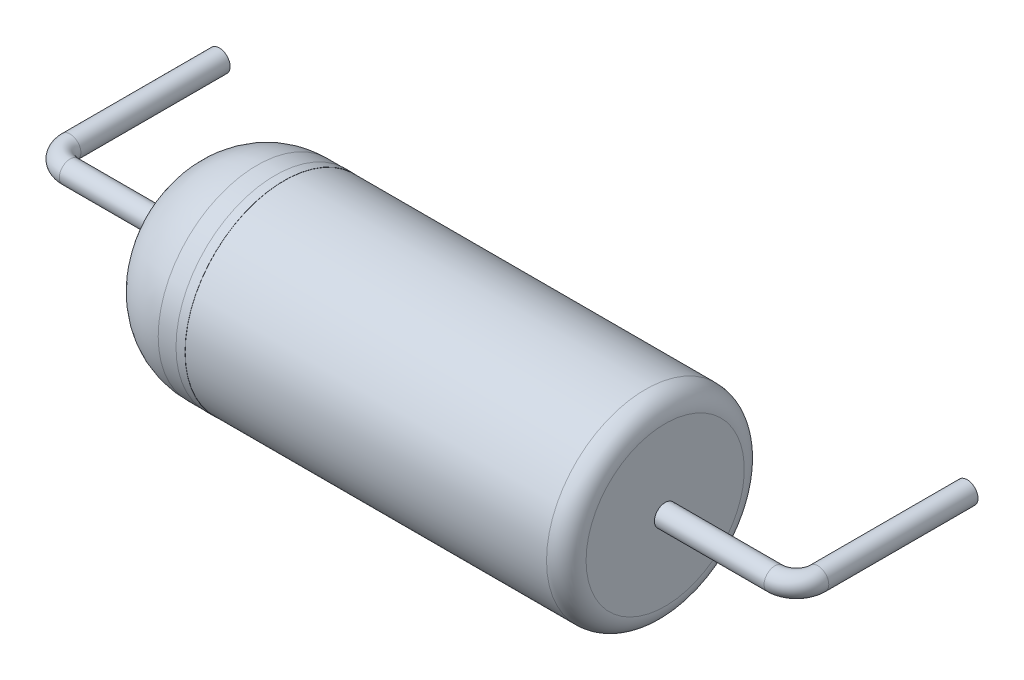
ISO-10303-21;
HEADER;
FILE_DESCRIPTION(('STEP AP214'),'2;1');
FILE_NAME('part.step','',(''),(''),'','','');
FILE_SCHEMA(('AUTOMOTIVE_DESIGN { 1 0 10303 214 1 1 1 1 }'));
ENDSEC;
DATA;
#1=APPLICATION_CONTEXT('core data for automotive mechanical design processes');
#2=APPLICATION_PROTOCOL_DEFINITION('international standard','automotive_design',2000,#1);
#3=PRODUCT_CONTEXT('',#1,'mechanical');
#4=PRODUCT('Part','Part','',(#3));
#5=PRODUCT_RELATED_PRODUCT_CATEGORY('part','',(#4));
#6=PRODUCT_DEFINITION_FORMATION('','',#4);
#7=PRODUCT_DEFINITION_CONTEXT('part definition',#1,'design');
#8=PRODUCT_DEFINITION('design','',#6,#7);
#9=PRODUCT_DEFINITION_SHAPE('','',#8);
#10=(LENGTH_UNIT() NAMED_UNIT(*) SI_UNIT(.MILLI.,.METRE.));
#11=(NAMED_UNIT(*) PLANE_ANGLE_UNIT() SI_UNIT($,.RADIAN.));
#12=(NAMED_UNIT(*) SI_UNIT($,.STERADIAN.) SOLID_ANGLE_UNIT());
#13=UNCERTAINTY_MEASURE_WITH_UNIT(LENGTH_MEASURE(1.E-05),#10,'distance_accuracy_value','');
#14=(GEOMETRIC_REPRESENTATION_CONTEXT(3) GLOBAL_UNCERTAINTY_ASSIGNED_CONTEXT((#13)) GLOBAL_UNIT_ASSIGNED_CONTEXT((#10,
#11,#12)) REPRESENTATION_CONTEXT('',''));
#15=CARTESIAN_POINT('',(0.,0.,0.));
#16=DIRECTION('',(0.,0.,1.));
#17=DIRECTION('',(1.,0.,0.));
#18=AXIS2_PLACEMENT_3D('',#15,#16,#17);
#19=CARTESIAN_POINT('',(-10.7,0.,-2.));
#20=DIRECTION('',(0.,0.,1.));
#21=DIRECTION('',(1.,0.,0.));
#22=AXIS2_PLACEMENT_3D('',#19,#20,#21);
#23=PLANE('',#22);
#24=CARTESIAN_POINT('',(-10.4,0.,-2.));
#25=DIRECTION('',(0.,0.,-1.));
#26=DIRECTION('',(-1.,0.,0.));
#27=AXIS2_PLACEMENT_3D('',#24,#25,#26);
#28=CIRCLE('',#27,0.3);
#29=CARTESIAN_POINT('',(-10.7,0.,-2.));
#30=VERTEX_POINT('',#29);
#31=EDGE_CURVE('P0_E11',#30,#30,#28,.T.);
#32=ORIENTED_EDGE('',*,*,#31,.T.);
#33=EDGE_LOOP('',(#32));
#34=FACE_BOUND('',#33,.T.);
#35=ADVANCED_FACE('P0_F16',(#34),#23,.F.);
#36=CARTESIAN_POINT('',(-10.4,0.,2.15));
#37=DIRECTION('',(0.,0.,-1.));
#38=DIRECTION('',(-1.,0.,0.));
#39=AXIS2_PLACEMENT_3D('',#36,#37,#38);
#40=CYLINDRICAL_SURFACE('',#39,0.3);
#41=DIRECTION('',(0.,0.,-1.));
#42=VECTOR('',#41,1.);
#43=CARTESIAN_POINT('',(-10.7,0.,2.15));
#44=LINE('',#43,#42);
#45=CARTESIAN_POINT('',(-10.7,0.,2.15));
#46=VERTEX_POINT('',#45);
#47=EDGE_CURVE('P0_E27',#46,#30,#44,.T.);
#48=ORIENTED_EDGE('',*,*,#47,.T.);
#49=ORIENTED_EDGE('',*,*,#31,.F.);
#50=ORIENTED_EDGE('',*,*,#47,.F.);
#51=CARTESIAN_POINT('',(-10.4,0.,2.15));
#52=DIRECTION('',(0.,0.,1.));
#53=DIRECTION('',(-1.,0.,0.));
#54=AXIS2_PLACEMENT_3D('',#51,#52,#53);
#55=CIRCLE('',#54,0.3);
#56=EDGE_CURVE('P0_E60',#46,#46,#55,.T.);
#57=ORIENTED_EDGE('',*,*,#56,.F.);
#58=EDGE_LOOP('',(#48,#49,#50,#57));
#59=FACE_BOUND('',#58,.T.);
#60=ADVANCED_FACE('P0_F18',(#59),#40,.T.);
#61=CARTESIAN_POINT('',(-9.8,0.,2.15));
#62=DIRECTION('',(0.,-1.,0.));
#63=DIRECTION('',(0.,0.,1.));
#64=AXIS2_PLACEMENT_3D('',#61,#62,#63);
#65=TOROIDAL_SURFACE('',#64,0.6,0.3);
#66=CARTESIAN_POINT('',(-9.8,0.,2.15));
#67=DIRECTION('',(0.,-1.,0.));
#68=DIRECTION('',(0.,0.,1.));
#69=AXIS2_PLACEMENT_3D('',#66,#67,#68);
#70=CIRCLE('',#69,0.9);
#71=CARTESIAN_POINT('',(-9.8,0.,3.05));
#72=VERTEX_POINT('',#71);
#73=EDGE_CURVE('P0_E56',#72,#46,#70,.T.);
#74=ORIENTED_EDGE('',*,*,#73,.T.);
#75=ORIENTED_EDGE('',*,*,#56,.T.);
#76=ORIENTED_EDGE('',*,*,#73,.F.);
#77=CARTESIAN_POINT('',(-9.8,0.,2.75));
#78=DIRECTION('',(-1.,0.,0.));
#79=DIRECTION('',(0.,0.,1.));
#80=AXIS2_PLACEMENT_3D('',#77,#78,#79);
#81=CIRCLE('',#80,0.3);
#82=EDGE_CURVE('P0_E58',#72,#72,#81,.T.);
#83=ORIENTED_EDGE('',*,*,#82,.T.);
#84=EDGE_LOOP('',(#74,#75,#76,#83));
#85=FACE_BOUND('',#84,.T.);
#86=ADVANCED_FACE('P0_F57',(#85),#65,.T.);
#87=CARTESIAN_POINT('',(-6.75,0.,2.75));
#88=DIRECTION('',(-1.,0.,0.));
#89=DIRECTION('',(0.,0.,1.));
#90=AXIS2_PLACEMENT_3D('',#87,#88,#89);
#91=CYLINDRICAL_SURFACE('',#90,0.3);
#92=DIRECTION('',(-1.,0.,0.));
#93=VECTOR('',#92,1.);
#94=CARTESIAN_POINT('',(-6.75,0.,3.05));
#95=LINE('',#94,#93);
#96=CARTESIAN_POINT('',(-6.75,0.,3.05));
#97=VERTEX_POINT('',#96);
#98=EDGE_CURVE('P0_E20',#97,#72,#95,.T.);
#99=ORIENTED_EDGE('',*,*,#98,.T.);
#100=ORIENTED_EDGE('',*,*,#82,.F.);
#101=ORIENTED_EDGE('',*,*,#98,.F.);
#102=CARTESIAN_POINT('',(-6.75,0.,2.75));
#103=DIRECTION('',(-1.,0.,0.));
#104=DIRECTION('',(0.,0.,1.));
#105=AXIS2_PLACEMENT_3D('',#102,#103,#104);
#106=CIRCLE('',#105,0.3);
#107=EDGE_CURVE('P0_E68',#97,#97,#106,.T.);
#108=ORIENTED_EDGE('',*,*,#107,.T.);
#109=EDGE_LOOP('',(#99,#100,#101,#108));
#110=FACE_BOUND('',#109,.T.);
#111=ADVANCED_FACE('P0_F75',(#110),#91,.T.);
#112=CARTESIAN_POINT('',(-6.75,0.,3.05));
#113=DIRECTION('',(1.,0.,0.));
#114=DIRECTION('',(0.,1.,0.));
#115=AXIS2_PLACEMENT_3D('',#112,#113,#114);
#116=PLANE('',#115);
#117=ORIENTED_EDGE('',*,*,#107,.F.);
#118=EDGE_LOOP('',(#117));
#119=FACE_BOUND('',#118,.T.);
#120=ADVANCED_FACE('P0_F77',(#119),#116,.T.);
#121=CLOSED_SHELL('',(#35,#60,#86,#111,#120));
#122=MANIFOLD_SOLID_BREP('P0_B1',#121);
#123=CARTESIAN_POINT('',(10.7,0.,-2.));
#124=DIRECTION('',(0.,0.,1.));
#125=DIRECTION('',(1.,0.,0.));
#126=AXIS2_PLACEMENT_3D('',#123,#124,#125);
#127=PLANE('',#126);
#128=CARTESIAN_POINT('',(10.4,0.,-2.));
#129=DIRECTION('',(0.,0.,-1.));
#130=DIRECTION('',(1.,0.,0.));
#131=AXIS2_PLACEMENT_3D('',#128,#129,#130);
#132=CIRCLE('',#131,0.3);
#133=CARTESIAN_POINT('',(10.7,0.,-2.));
#134=VERTEX_POINT('',#133);
#135=EDGE_CURVE('P1_E11',#134,#134,#132,.T.);
#136=ORIENTED_EDGE('',*,*,#135,.T.);
#137=EDGE_LOOP('',(#136));
#138=FACE_BOUND('',#137,.T.);
#139=ADVANCED_FACE('P1_F16',(#138),#127,.F.);
#140=CARTESIAN_POINT('',(10.4,0.,2.15));
#141=DIRECTION('',(0.,0.,-1.));
#142=DIRECTION('',(1.,0.,0.));
#143=AXIS2_PLACEMENT_3D('',#140,#141,#142);
#144=CYLINDRICAL_SURFACE('',#143,0.3);
#145=DIRECTION('',(0.,0.,-1.));
#146=VECTOR('',#145,1.);
#147=CARTESIAN_POINT('',(10.7,0.,2.15));
#148=LINE('',#147,#146);
#149=CARTESIAN_POINT('',(10.7,0.,2.15));
#150=VERTEX_POINT('',#149);
#151=EDGE_CURVE('P1_E26',#150,#134,#148,.T.);
#152=ORIENTED_EDGE('',*,*,#151,.T.);
#153=ORIENTED_EDGE('',*,*,#135,.F.);
#154=ORIENTED_EDGE('',*,*,#151,.F.);
#155=CARTESIAN_POINT('',(10.4,0.,2.15));
#156=DIRECTION('',(0.,0.,1.));
#157=DIRECTION('',(1.,0.,0.));
#158=AXIS2_PLACEMENT_3D('',#155,#156,#157);
#159=CIRCLE('',#158,0.3);
#160=EDGE_CURVE('P1_E75',#150,#150,#159,.T.);
#161=ORIENTED_EDGE('',*,*,#160,.F.);
#162=EDGE_LOOP('',(#152,#153,#154,#161));
#163=FACE_BOUND('',#162,.T.);
#164=ADVANCED_FACE('P1_F81',(#163),#144,.T.);
#165=CARTESIAN_POINT('',(9.8,0.,2.15));
#166=DIRECTION('',(0.,1.,0.));
#167=DIRECTION('',(0.,0.,1.));
#168=AXIS2_PLACEMENT_3D('',#165,#166,#167);
#169=TOROIDAL_SURFACE('',#168,0.6,0.3);
#170=CARTESIAN_POINT('',(9.8,0.,2.15));
#171=DIRECTION('',(0.,1.,0.));
#172=DIRECTION('',(0.,0.,1.));
#173=AXIS2_PLACEMENT_3D('',#170,#171,#172);
#174=CIRCLE('',#173,0.9);
#175=CARTESIAN_POINT('',(9.8,0.,3.05));
#176=VERTEX_POINT('',#175);
#177=EDGE_CURVE('P1_E64',#176,#150,#174,.T.);
#178=ORIENTED_EDGE('',*,*,#177,.T.);
#179=ORIENTED_EDGE('',*,*,#160,.T.);
#180=ORIENTED_EDGE('',*,*,#177,.F.);
#181=CARTESIAN_POINT('',(9.8,0.,2.75));
#182=DIRECTION('',(1.,0.,0.));
#183=DIRECTION('',(0.,0.,1.));
#184=AXIS2_PLACEMENT_3D('',#181,#182,#183);
#185=CIRCLE('',#184,0.3);
#186=EDGE_CURVE('P1_E59',#176,#176,#185,.T.);
#187=ORIENTED_EDGE('',*,*,#186,.T.);
#188=EDGE_LOOP('',(#178,#179,#180,#187));
#189=FACE_BOUND('',#188,.T.);
#190=ADVANCED_FACE('P1_F83',(#189),#169,.T.);
#191=CARTESIAN_POINT('',(6.75,0.,2.75));
#192=DIRECTION('',(1.,0.,0.));
#193=DIRECTION('',(0.,0.,1.));
#194=AXIS2_PLACEMENT_3D('',#191,#192,#193);
#195=CYLINDRICAL_SURFACE('',#194,0.3);
#196=DIRECTION('',(1.,0.,0.));
#197=VECTOR('',#196,1.);
#198=CARTESIAN_POINT('',(6.75,0.,3.05));
#199=LINE('',#198,#197);
#200=CARTESIAN_POINT('',(6.75,0.,3.05));
#201=VERTEX_POINT('',#200);
#202=EDGE_CURVE('P1_E20',#201,#176,#199,.T.);
#203=ORIENTED_EDGE('',*,*,#202,.T.);
#204=ORIENTED_EDGE('',*,*,#186,.F.);
#205=ORIENTED_EDGE('',*,*,#202,.F.);
#206=CARTESIAN_POINT('',(6.75,0.,2.75));
#207=DIRECTION('',(1.,0.,0.));
#208=DIRECTION('',(0.,0.,1.));
#209=AXIS2_PLACEMENT_3D('',#206,#207,#208);
#210=CIRCLE('',#209,0.3);
#211=EDGE_CURVE('P1_E57',#201,#201,#210,.T.);
#212=ORIENTED_EDGE('',*,*,#211,.T.);
#213=EDGE_LOOP('',(#203,#204,#205,#212));
#214=FACE_BOUND('',#213,.T.);
#215=ADVANCED_FACE('P1_F55',(#214),#195,.T.);
#216=CARTESIAN_POINT('',(6.75,0.,3.05));
#217=DIRECTION('',(-1.,0.,0.));
#218=DIRECTION('',(0.,0.,1.));
#219=AXIS2_PLACEMENT_3D('',#216,#217,#218);
#220=PLANE('',#219);
#221=ORIENTED_EDGE('',*,*,#211,.F.);
#222=EDGE_LOOP('',(#221));
#223=FACE_BOUND('',#222,.T.);
#224=ADVANCED_FACE('P1_F18',(#223),#220,.T.);
#225=CLOSED_SHELL('',(#139,#164,#190,#215,#224));
#226=MANIFOLD_SOLID_BREP('P1_B1',#225);
#227=CARTESIAN_POINT('',(6.75,0.,2.75));
#228=DIRECTION('',(1.,0.,0.));
#229=DIRECTION('',(0.,1.,0.));
#230=AXIS2_PLACEMENT_3D('',#227,#228,#229);
#231=PLANE('',#230);
#232=CARTESIAN_POINT('',(6.75,0.,2.75));
#233=DIRECTION('',(1.,0.,0.));
#234=DIRECTION('',(0.,0.,1.));
#235=AXIS2_PLACEMENT_3D('',#232,#233,#234);
#236=CIRCLE('',#235,2.2);
#237=CARTESIAN_POINT('',(6.75,0.,4.95));
#238=VERTEX_POINT('',#237);
#239=EDGE_CURVE('P2_E11',#238,#238,#236,.T.);
#240=ORIENTED_EDGE('',*,*,#239,.T.);
#241=EDGE_LOOP('',(#240));
#242=FACE_BOUND('',#241,.T.);
#243=ADVANCED_FACE('P2_F16',(#242),#231,.T.);
#244=CARTESIAN_POINT('',(6.2,0.,2.75));
#245=DIRECTION('',(1.,0.,0.));
#246=DIRECTION('',(0.,0.,1.));
#247=AXIS2_PLACEMENT_3D('',#244,#245,#246);
#248=TOROIDAL_SURFACE('',#247,2.2,0.55);
#249=CARTESIAN_POINT('',(6.2,0.,2.75));
#250=DIRECTION('',(1.,0.,0.));
#251=DIRECTION('',(0.,0.,1.));
#252=AXIS2_PLACEMENT_3D('',#249,#250,#251);
#253=CIRCLE('',#252,2.75);
#254=CARTESIAN_POINT('',(6.2,0.,5.5));
#255=VERTEX_POINT('',#254);
#256=EDGE_CURVE('P2_E72',#255,#255,#253,.T.);
#257=ORIENTED_EDGE('',*,*,#256,.T.);
#258=CARTESIAN_POINT('',(6.2,0.,4.95));
#259=DIRECTION('',(0.,1.,0.));
#260=DIRECTION('',(0.,0.,1.));
#261=AXIS2_PLACEMENT_3D('',#258,#259,#260);
#262=CIRCLE('',#261,0.55);
#263=EDGE_CURVE('P2_E29',#255,#238,#262,.T.);
#264=ORIENTED_EDGE('',*,*,#263,.T.);
#265=ORIENTED_EDGE('',*,*,#239,.F.);
#266=ORIENTED_EDGE('',*,*,#263,.F.);
#267=EDGE_LOOP('',(#257,#264,#265,#266));
#268=FACE_BOUND('',#267,.T.);
#269=ADVANCED_FACE('P2_F80',(#268),#248,.T.);
#270=CARTESIAN_POINT('',(-4.6,0.,2.75));
#271=DIRECTION('',(1.,0.,0.));
#272=DIRECTION('',(0.,0.,1.));
#273=AXIS2_PLACEMENT_3D('',#270,#271,#272);
#274=CYLINDRICAL_SURFACE('',#273,2.75);
#275=CARTESIAN_POINT('',(-4.6,0.,2.75));
#276=DIRECTION('',(1.,0.,0.));
#277=DIRECTION('',(0.,0.,1.));
#278=AXIS2_PLACEMENT_3D('',#275,#276,#277);
#279=CIRCLE('',#278,2.75);
#280=CARTESIAN_POINT('',(-4.6,0.,5.5));
#281=VERTEX_POINT('',#280);
#282=EDGE_CURVE('P2_E61',#281,#281,#279,.T.);
#283=ORIENTED_EDGE('',*,*,#282,.T.);
#284=DIRECTION('',(1.,0.,0.));
#285=VECTOR('',#284,1.);
#286=CARTESIAN_POINT('',(-4.6,0.,5.5));
#287=LINE('',#286,#285);
#288=EDGE_CURVE('P2_E49',#281,#255,#287,.T.);
#289=ORIENTED_EDGE('',*,*,#288,.T.);
#290=ORIENTED_EDGE('',*,*,#256,.F.);
#291=ORIENTED_EDGE('',*,*,#288,.F.);
#292=EDGE_LOOP('',(#283,#289,#290,#291));
#293=FACE_BOUND('',#292,.T.);
#294=ADVANCED_FACE('P2_F81',(#293),#274,.T.);
#295=CARTESIAN_POINT('',(-6.75,0.,3.35));
#296=CARTESIAN_POINT('',(-6.75,0.,4.60944084089784));
#297=CARTESIAN_POINT('',(-5.85944084089785,0.,5.5));
#298=CARTESIAN_POINT('',(-4.6,0.,5.5));
#299=(BOUNDED_CURVE() B_SPLINE_CURVE(3,(#295,#296,#297,#298),.UNSPECIFIED.,.F.,
.F.) B_SPLINE_CURVE_WITH_KNOTS((4,4),(0.,1.),
.UNSPECIFIED.) CURVE() GEOMETRIC_REPRESENTATION_ITEM() RATIONAL_B_SPLINE_CURVE((1.,
0.804737854124365,0.804737854124365,1.)) REPRESENTATION_ITEM(''));
#300=CARTESIAN_POINT('',(0.,0.,2.75));
#301=DIRECTION('',(-1.,0.,0.));
#302=AXIS1_PLACEMENT('',#300,#301);
#303=SURFACE_OF_REVOLUTION('',#299,#302);
#304=CARTESIAN_POINT('',(-6.75,0.,2.75));
#305=DIRECTION('',(1.,0.,0.));
#306=DIRECTION('',(0.,0.,1.));
#307=AXIS2_PLACEMENT_3D('',#304,#305,#306);
#308=CIRCLE('',#307,0.6);
#309=CARTESIAN_POINT('',(-6.75,0.,3.35));
#310=VERTEX_POINT('',#309);
#311=EDGE_CURVE('P2_E60',#310,#310,#308,.T.);
#312=ORIENTED_EDGE('',*,*,#311,.T.);
#313=CARTESIAN_POINT('',(-4.6,0.,3.35));
#314=DIRECTION('',(0.,1.,0.));
#315=DIRECTION('',(-1.,0.,0.));
#316=AXIS2_PLACEMENT_3D('',#313,#314,#315);
#317=CIRCLE('',#316,2.15);
#318=EDGE_CURVE('P2_E58',#310,#281,#317,.T.);
#319=ORIENTED_EDGE('',*,*,#318,.T.);
#320=ORIENTED_EDGE('',*,*,#282,.F.);
#321=ORIENTED_EDGE('',*,*,#318,.F.);
#322=EDGE_LOOP('',(#312,#319,#320,#321));
#323=FACE_BOUND('',#322,.T.);
#324=ADVANCED_FACE('P2_F18',(#323),#303,.F.);
#325=CARTESIAN_POINT('',(-6.75,0.,2.75));
#326=DIRECTION('',(1.,0.,0.));
#327=DIRECTION('',(0.,1.,0.));
#328=AXIS2_PLACEMENT_3D('',#325,#326,#327);
#329=PLANE('',#328);
#330=ORIENTED_EDGE('',*,*,#311,.F.);
#331=EDGE_LOOP('',(#330));
#332=FACE_BOUND('',#331,.T.);
#333=ADVANCED_FACE('P2_F89',(#332),#329,.F.);
#334=CLOSED_SHELL('',(#243,#269,#294,#324,#333));
#335=MANIFOLD_SOLID_BREP('P2_B1',#334);
#336=CARTESIAN_POINT('',(-3.85,0.,2.75));
#337=DIRECTION('',(-1.,0.,0.));
#338=DIRECTION('',(0.,0.,1.));
#339=AXIS2_PLACEMENT_3D('',#336,#337,#338);
#340=CYLINDRICAL_SURFACE('',#339,2.755);
#341=DIRECTION('',(-1.,0.,0.));
#342=VECTOR('',#341,1.);
#343=CARTESIAN_POINT('',(-3.85,0.,5.505));
#344=LINE('',#343,#342);
#345=CARTESIAN_POINT('',(-3.85,0.,5.505));
#346=VERTEX_POINT('',#345);
#347=CARTESIAN_POINT('',(-4.1,0.,5.505));
#348=VERTEX_POINT('',#347);
#349=EDGE_CURVE('P3_E11',#346,#348,#344,.T.);
#350=ORIENTED_EDGE('',*,*,#349,.T.);
#351=CARTESIAN_POINT('',(-4.1,0.,2.75));
#352=DIRECTION('',(1.,0.,0.));
#353=DIRECTION('',(0.,0.,1.));
#354=AXIS2_PLACEMENT_3D('',#351,#352,#353);
#355=CIRCLE('',#354,2.755);
#356=EDGE_CURVE('P3_E47',#348,#348,#355,.T.);
#357=ORIENTED_EDGE('',*,*,#356,.T.);
#358=ORIENTED_EDGE('',*,*,#349,.F.);
#359=CARTESIAN_POINT('',(-3.85,0.,2.75));
#360=DIRECTION('',(1.,0.,0.));
#361=DIRECTION('',(0.,0.,1.));
#362=AXIS2_PLACEMENT_3D('',#359,#360,#361);
#363=CIRCLE('',#362,2.755);
#364=EDGE_CURVE('P3_E19',#346,#346,#363,.T.);
#365=ORIENTED_EDGE('',*,*,#364,.F.);
#366=EDGE_LOOP('',(#350,#357,#358,#365));
#367=FACE_BOUND('',#366,.T.);
#368=ADVANCED_FACE('P3_F16',(#367),#340,.T.);
#369=CARTESIAN_POINT('',(-3.85,0.,2.75));
#370=DIRECTION('',(1.,0.,0.));
#371=DIRECTION('',(0.,1.,0.));
#372=AXIS2_PLACEMENT_3D('',#369,#370,#371);
#373=PLANE('',#372);
#374=ORIENTED_EDGE('',*,*,#364,.T.);
#375=EDGE_LOOP('',(#374));
#376=FACE_BOUND('',#375,.T.);
#377=CARTESIAN_POINT('',(-3.85,0.,2.75));
#378=DIRECTION('',(1.,0.,0.));
#379=DIRECTION('',(0.,0.,1.));
#380=AXIS2_PLACEMENT_3D('',#377,#378,#379);
#381=CIRCLE('',#380,2.75);
#382=CARTESIAN_POINT('',(-3.85,0.,5.5));
#383=VERTEX_POINT('',#382);
#384=EDGE_CURVE('P3_E50',#383,#383,#381,.T.);
#385=ORIENTED_EDGE('',*,*,#384,.F.);
#386=EDGE_LOOP('',(#385));
#387=FACE_BOUND('',#386,.T.);
#388=ADVANCED_FACE('P3_F74',(#376,#387),#373,.T.);
#389=CARTESIAN_POINT('',(-4.1,0.,2.75));
#390=DIRECTION('',(1.,0.,0.));
#391=DIRECTION('',(0.,0.,1.));
#392=AXIS2_PLACEMENT_3D('',#389,#390,#391);
#393=CYLINDRICAL_SURFACE('',#392,2.75);
#394=DIRECTION('',(1.,0.,0.));
#395=VECTOR('',#394,1.);
#396=CARTESIAN_POINT('',(-4.1,0.,5.5));
#397=LINE('',#396,#395);
#398=CARTESIAN_POINT('',(-4.1,0.,5.5));
#399=VERTEX_POINT('',#398);
#400=EDGE_CURVE('P3_E55',#399,#383,#397,.T.);
#401=ORIENTED_EDGE('',*,*,#400,.T.);
#402=ORIENTED_EDGE('',*,*,#384,.T.);
#403=ORIENTED_EDGE('',*,*,#400,.F.);
#404=CARTESIAN_POINT('',(-4.1,0.,2.75));
#405=DIRECTION('',(1.,0.,0.));
#406=DIRECTION('',(0.,0.,1.));
#407=AXIS2_PLACEMENT_3D('',#404,#405,#406);
#408=CIRCLE('',#407,2.75);
#409=EDGE_CURVE('P3_E63',#399,#399,#408,.T.);
#410=ORIENTED_EDGE('',*,*,#409,.F.);
#411=EDGE_LOOP('',(#401,#402,#403,#410));
#412=FACE_BOUND('',#411,.T.);
#413=ADVANCED_FACE('P3_F72',(#412),#393,.F.);
#414=CARTESIAN_POINT('',(-4.1,0.,2.75));
#415=DIRECTION('',(1.,0.,0.));
#416=DIRECTION('',(0.,1.,0.));
#417=AXIS2_PLACEMENT_3D('',#414,#415,#416);
#418=PLANE('',#417);
#419=ORIENTED_EDGE('',*,*,#409,.T.);
#420=EDGE_LOOP('',(#419));
#421=FACE_BOUND('',#420,.T.);
#422=ORIENTED_EDGE('',*,*,#356,.F.);
#423=EDGE_LOOP('',(#422));
#424=FACE_BOUND('',#423,.T.);
#425=ADVANCED_FACE('P3_F70',(#421,#424),#418,.F.);
#426=CLOSED_SHELL('',(#368,#388,#413,#425));
#427=MANIFOLD_SOLID_BREP('P3_B1',#426);
#428=ADVANCED_BREP_SHAPE_REPRESENTATION('',(#18,#122,#226,#335,#427),#14);
#429=SHAPE_DEFINITION_REPRESENTATION(#9,#428);
ENDSEC;
END-ISO-10303-21;
